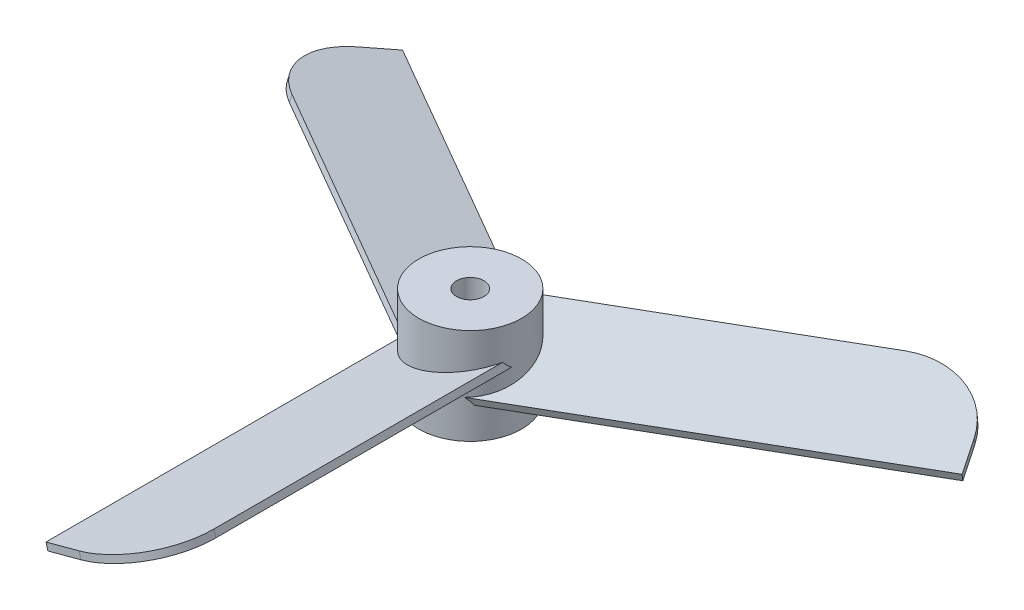
ISO-10303-21;
HEADER;
FILE_DESCRIPTION(('STEP AP214'),'2;1');
FILE_NAME('part.step','',(''),(''),'','','');
FILE_SCHEMA(('AUTOMOTIVE_DESIGN { 1 0 10303 214 1 1 1 1 }'));
ENDSEC;
DATA;
#1=APPLICATION_CONTEXT('core data for automotive mechanical design processes');
#2=APPLICATION_PROTOCOL_DEFINITION('international standard','automotive_design',2000,#1);
#3=PRODUCT_CONTEXT('',#1,'mechanical');
#4=PRODUCT('Part','Part','',(#3));
#5=PRODUCT_RELATED_PRODUCT_CATEGORY('part','',(#4));
#6=PRODUCT_DEFINITION_FORMATION('','',#4);
#7=PRODUCT_DEFINITION_CONTEXT('part definition',#1,'design');
#8=PRODUCT_DEFINITION('design','',#6,#7);
#9=PRODUCT_DEFINITION_SHAPE('','',#8);
#10=(LENGTH_UNIT() NAMED_UNIT(*) SI_UNIT(.MILLI.,.METRE.));
#11=(NAMED_UNIT(*) PLANE_ANGLE_UNIT() SI_UNIT($,.RADIAN.));
#12=(NAMED_UNIT(*) SI_UNIT($,.STERADIAN.) SOLID_ANGLE_UNIT());
#13=UNCERTAINTY_MEASURE_WITH_UNIT(LENGTH_MEASURE(1.E-05),#10,'distance_accuracy_value','');
#14=(GEOMETRIC_REPRESENTATION_CONTEXT(3) GLOBAL_UNCERTAINTY_ASSIGNED_CONTEXT((#13)) GLOBAL_UNIT_ASSIGNED_CONTEXT((#10,
#11,#12)) REPRESENTATION_CONTEXT('',''));
#15=CARTESIAN_POINT('',(0.,0.,0.));
#16=DIRECTION('',(0.,0.,1.));
#17=DIRECTION('',(1.,0.,0.));
#18=AXIS2_PLACEMENT_3D('',#15,#16,#17);
#19=CARTESIAN_POINT('',(0.,14.,0.));
#20=DIRECTION('',(0.,-1.,0.));
#21=DIRECTION('',(0.,0.,-1.));
#22=AXIS2_PLACEMENT_3D('',#19,#20,#21);
#23=CYLINDRICAL_SURFACE('',#22,7.5);
#24=CARTESIAN_POINT('',(0.,-21.9777747886716,0.));
#25=DIRECTION('',(-0.482962913144526,0.258819045102524,-0.836516303737811));
#26=DIRECTION('',(-0.12940952255126,-0.965925826289067,-0.224143868042018));
#27=AXIS2_PLACEMENT_3D('',#24,#25,#26);
#28=ELLIPSE('',#27,28.9777747886716,7.5);
#29=CARTESIAN_POINT('',(5.62125049264613,4.55885716173106,4.96503201388728));
#30=VERTEX_POINT('',#29);
#31=CARTESIAN_POINT('',(4.85398707226255,5.55885716173106,5.7174128329436));
#32=VERTEX_POINT('',#31);
#33=EDGE_CURVE('E157',#30,#32,#28,.F.);
#34=ORIENTED_EDGE('',*,*,#33,.T.);
#35=CARTESIAN_POINT('',(0.,7.53589838486225,0.));
#36=DIRECTION('',(0.12940952255126,0.965925826289067,0.224143868042018));
#37=DIRECTION('',(0.482962913144526,-0.258819045102525,0.836516303737811));
#38=AXIS2_PLACEMENT_3D('',#35,#36,#37);
#39=ELLIPSE('',#38,7.76457135307563,7.5);
#40=CARTESIAN_POINT('',(-1.48921860830618,9.44114283826893,-7.35066173461101));
#41=VERTEX_POINT('',#40);
#42=EDGE_CURVE('E145',#32,#41,#39,.T.);
#43=ORIENTED_EDGE('',*,*,#42,.T.);
#44=CARTESIAN_POINT('',(0.,35.9777747886716,0.));
#45=DIRECTION('',(-0.482962913144526,0.258819045102525,-0.836516303737811));
#46=DIRECTION('',(-0.12940952255126,-0.965925826289067,-0.224143868042018));
#47=AXIS2_PLACEMENT_3D('',#44,#45,#46);
#48=ELLIPSE('',#47,28.9777747886716,7.5);
#49=CARTESIAN_POINT('',(-2.52443122112087,8.44114283826893,-7.06238253069247));
#50=VERTEX_POINT('',#49);
#51=EDGE_CURVE('E155',#50,#41,#48,.F.);
#52=ORIENTED_EDGE('',*,*,#51,.F.);
#53=CARTESIAN_POINT('',(0.,6.46410161513775,0.));
#54=DIRECTION('',(0.12940952255126,0.965925826289067,0.224143868042018));
#55=DIRECTION('',(0.482962913144526,-0.258819045102525,0.836516303737812));
#56=AXIS2_PLACEMENT_3D('',#53,#54,#55);
#57=ELLIPSE('',#56,7.76457135307563,7.5);
#58=EDGE_CURVE('E161',#30,#50,#57,.T.);
#59=ORIENTED_EDGE('',*,*,#58,.F.);
#60=EDGE_LOOP('',(#34,#43,#52,#59));
#61=FACE_BOUND('',#60,.T.);
#62=CARTESIAN_POINT('',(0.,-21.9777747886716,0.));
#63=DIRECTION('',(0.965925826289067,0.258819045102524,0.));
#64=DIRECTION('',(0.258819045102525,-0.965925826289067,0.));
#65=AXIS2_PLACEMENT_3D('',#62,#63,#64);
#66=ELLIPSE('',#65,28.9777747886716,7.5);
#67=CARTESIAN_POINT('',(-7.11046910095244,4.55885716173106,2.38562972072377));
#68=VERTEX_POINT('',#67);
#69=CARTESIAN_POINT('',(-7.37841829338357,5.55885716173106,1.34496969774889));
#70=VERTEX_POINT('',#69);
#71=EDGE_CURVE('E227',#68,#70,#66,.F.);
#72=ORIENTED_EDGE('',*,*,#71,.T.);
#73=CARTESIAN_POINT('',(0.,7.53589838486225,0.));
#74=DIRECTION('',(-0.258819045102525,0.965925826289067,0.));
#75=DIRECTION('',(-0.965925826289067,-0.258819045102525,0.));
#76=AXIS2_PLACEMENT_3D('',#73,#74,#75);
#77=ELLIPSE('',#76,7.76457135307563,7.5);
#78=CARTESIAN_POINT('',(7.11046910095244,9.44114283826893,2.38562972072377));
#79=VERTEX_POINT('',#78);
#80=EDGE_CURVE('E277',#70,#79,#77,.T.);
#81=ORIENTED_EDGE('',*,*,#80,.T.);
#82=CARTESIAN_POINT('',(0.,35.9777747886716,0.));
#83=DIRECTION('',(0.965925826289067,0.258819045102525,0.));
#84=DIRECTION('',(0.258819045102525,-0.965925826289067,0.));
#85=AXIS2_PLACEMENT_3D('',#82,#83,#84);
#86=ELLIPSE('',#85,28.9777747886716,7.5);
#87=CARTESIAN_POINT('',(7.37841829338357,8.44114283826893,1.34496969774889));
#88=VERTEX_POINT('',#87);
#89=EDGE_CURVE('E214',#88,#79,#86,.F.);
#90=ORIENTED_EDGE('',*,*,#89,.F.);
#91=CARTESIAN_POINT('',(0.,6.46410161513775,0.));
#92=DIRECTION('',(-0.258819045102525,0.965925826289067,0.));
#93=DIRECTION('',(-0.965925826289067,-0.258819045102525,0.));
#94=AXIS2_PLACEMENT_3D('',#91,#92,#93);
#95=ELLIPSE('',#94,7.76457135307563,7.5);
#96=EDGE_CURVE('E270',#68,#88,#95,.T.);
#97=ORIENTED_EDGE('',*,*,#96,.F.);
#98=EDGE_LOOP('',(#72,#81,#90,#97));
#99=FACE_BOUND('',#98,.T.);
#100=CARTESIAN_POINT('',(0.,0.,0.));
#101=DIRECTION('',(0.,1.,0.));
#102=DIRECTION('',(0.,0.,1.));
#103=AXIS2_PLACEMENT_3D('',#100,#101,#102);
#104=CIRCLE('',#103,7.5);
#105=CARTESIAN_POINT('',(0.,0.,7.5));
#106=VERTEX_POINT('',#105);
#107=EDGE_CURVE('E265',#106,#106,#104,.T.);
#108=ORIENTED_EDGE('',*,*,#107,.T.);
#109=EDGE_LOOP('',(#108));
#110=FACE_BOUND('',#109,.T.);
#111=CARTESIAN_POINT('',(0.,14.,0.));
#112=DIRECTION('',(0.,1.,0.));
#113=DIRECTION('',(0.,0.,1.));
#114=AXIS2_PLACEMENT_3D('',#111,#112,#113);
#115=CIRCLE('',#114,7.5);
#116=CARTESIAN_POINT('',(0.,14.,7.5));
#117=VERTEX_POINT('',#116);
#118=EDGE_CURVE('E266',#117,#117,#115,.T.);
#119=ORIENTED_EDGE('',*,*,#118,.F.);
#120=EDGE_LOOP('',(#119));
#121=FACE_BOUND('',#120,.T.);
#122=CARTESIAN_POINT('',(0.,-21.9777747886716,0.));
#123=DIRECTION('',(-0.482962913144538,0.258819045102524,0.836516303737805));
#124=DIRECTION('',(-0.129409522551263,-0.965925826289067,0.224143868042016));
#125=AXIS2_PLACEMENT_3D('',#122,#123,#124);
#126=ELLIPSE('',#125,28.9777747886716,7.5);
#127=CARTESIAN_POINT('',(1.48921860830627,4.55885716173106,-7.35066173461101));
#128=VERTEX_POINT('',#127);
#129=CARTESIAN_POINT('',(2.52443122112101,5.55885716173106,-7.06238253069243));
#130=VERTEX_POINT('',#129);
#131=EDGE_CURVE('E193',#128,#130,#126,.F.);
#132=ORIENTED_EDGE('',*,*,#131,.T.);
#133=CARTESIAN_POINT('',(0.,7.53589838486224,0.));
#134=DIRECTION('',(0.129409522551263,0.965925826289067,-0.224143868042016));
#135=DIRECTION('',(0.482962913144538,-0.258819045102525,-0.836516303737805));
#136=AXIS2_PLACEMENT_3D('',#133,#134,#135);
#137=ELLIPSE('',#136,7.76457135307563,7.5);
#138=CARTESIAN_POINT('',(-5.62125049264621,9.44114283826893,4.96503201388719));
#139=VERTEX_POINT('',#138);
#140=EDGE_CURVE('E298',#130,#139,#137,.T.);
#141=ORIENTED_EDGE('',*,*,#140,.T.);
#142=CARTESIAN_POINT('',(0.,35.9777747886716,0.));
#143=DIRECTION('',(-0.482962913144538,0.258819045102525,0.836516303737805));
#144=DIRECTION('',(-0.129409522551263,-0.965925826289067,0.224143868042016));
#145=AXIS2_PLACEMENT_3D('',#142,#143,#144);
#146=ELLIPSE('',#145,28.9777747886716,7.5);
#147=CARTESIAN_POINT('',(-4.85398707226262,8.44114283826893,5.71741283294353));
#148=VERTEX_POINT('',#147);
#149=EDGE_CURVE('E183',#148,#139,#146,.F.);
#150=ORIENTED_EDGE('',*,*,#149,.F.);
#151=CARTESIAN_POINT('',(0.,6.46410161513775,0.));
#152=DIRECTION('',(0.129409522551263,0.965925826289067,-0.224143868042016));
#153=DIRECTION('',(0.482962913144538,-0.258819045102525,-0.836516303737805));
#154=AXIS2_PLACEMENT_3D('',#151,#152,#153);
#155=ELLIPSE('',#154,7.76457135307563,7.5);
#156=EDGE_CURVE('E294',#128,#148,#155,.T.);
#157=ORIENTED_EDGE('',*,*,#156,.F.);
#158=EDGE_LOOP('',(#132,#141,#150,#157));
#159=FACE_BOUND('',#158,.T.);
#160=ADVANCED_FACE('F39',(#61,#99,#110,#121,#159),#23,.T.);
#161=CARTESIAN_POINT('',(0.,14.,0.));
#162=DIRECTION('',(0.,1.,0.));
#163=DIRECTION('',(0.,0.,1.));
#164=AXIS2_PLACEMENT_3D('',#161,#162,#163);
#165=PLANE('',#164);
#166=CARTESIAN_POINT('',(0.,14.,0.));
#167=DIRECTION('',(0.,1.,0.));
#168=DIRECTION('',(0.,0.,1.));
#169=AXIS2_PLACEMENT_3D('',#166,#167,#168);
#170=CIRCLE('',#169,2.);
#171=CARTESIAN_POINT('',(0.,14.,2.));
#172=VERTEX_POINT('',#171);
#173=EDGE_CURVE('E248',#172,#172,#170,.T.);
#174=ORIENTED_EDGE('',*,*,#173,.F.);
#175=EDGE_LOOP('',(#174));
#176=FACE_BOUND('',#175,.T.);
#177=ORIENTED_EDGE('',*,*,#118,.T.);
#178=EDGE_LOOP('',(#177));
#179=FACE_BOUND('',#178,.T.);
#180=ADVANCED_FACE('F341',(#176,#179),#165,.T.);
#181=CARTESIAN_POINT('',(0.,0.,0.));
#182=DIRECTION('',(0.,1.,0.));
#183=DIRECTION('',(0.,0.,1.));
#184=AXIS2_PLACEMENT_3D('',#181,#182,#183);
#185=PLANE('',#184);
#186=CARTESIAN_POINT('',(0.,0.,0.));
#187=DIRECTION('',(0.,1.,0.));
#188=DIRECTION('',(0.,0.,1.));
#189=AXIS2_PLACEMENT_3D('',#186,#187,#188);
#190=CIRCLE('',#189,2.);
#191=CARTESIAN_POINT('',(0.,0.,2.));
#192=VERTEX_POINT('',#191);
#193=EDGE_CURVE('E261',#192,#192,#190,.F.);
#194=ORIENTED_EDGE('',*,*,#193,.F.);
#195=EDGE_LOOP('',(#194));
#196=FACE_BOUND('',#195,.T.);
#197=ORIENTED_EDGE('',*,*,#107,.F.);
#198=EDGE_LOOP('',(#197));
#199=FACE_BOUND('',#198,.T.);
#200=ADVANCED_FACE('F346',(#196,#199),#185,.F.);
#201=CARTESIAN_POINT('',(0.,-0.000999999999999265,0.));
#202=DIRECTION('',(0.,1.,0.));
#203=DIRECTION('',(0.,0.,1.));
#204=AXIS2_PLACEMENT_3D('',#201,#202,#203);
#205=CYLINDRICAL_SURFACE('',#204,2.);
#206=CARTESIAN_POINT('',(0.,14.,2.));
#207=CARTESIAN_POINT('',(0.,13.8541666666667,2.));
#208=CARTESIAN_POINT('',(0.,13.7083333333333,2.));
#209=CARTESIAN_POINT('',(0.,13.4166666666667,2.));
#210=CARTESIAN_POINT('',(0.,13.2708333333333,2.));
#211=CARTESIAN_POINT('',(0.,12.9791666666667,2.));
#212=CARTESIAN_POINT('',(0.,12.8333333333333,2.));
#213=CARTESIAN_POINT('',(0.,12.5416666666667,2.));
#214=CARTESIAN_POINT('',(0.,12.3958333333333,2.));
#215=CARTESIAN_POINT('',(0.,12.1041666666667,2.));
#216=CARTESIAN_POINT('',(0.,11.9583333333333,2.));
#217=CARTESIAN_POINT('',(0.,11.6666666666667,2.));
#218=CARTESIAN_POINT('',(0.,11.5208333333333,2.));
#219=CARTESIAN_POINT('',(0.,11.2291666666667,2.));
#220=CARTESIAN_POINT('',(0.,11.0833333333333,2.));
#221=CARTESIAN_POINT('',(0.,10.7916666666667,2.));
#222=CARTESIAN_POINT('',(0.,10.6458333333333,2.));
#223=CARTESIAN_POINT('',(0.,10.3541666666667,2.));
#224=CARTESIAN_POINT('',(0.,10.2083333333333,2.));
#225=CARTESIAN_POINT('',(0.,9.91666666666667,2.));
#226=CARTESIAN_POINT('',(0.,9.77083333333333,2.));
#227=CARTESIAN_POINT('',(0.,9.47916666666667,2.));
#228=CARTESIAN_POINT('',(0.,9.33333333333333,2.));
#229=CARTESIAN_POINT('',(0.,9.04166666666666,2.));
#230=CARTESIAN_POINT('',(0.,8.89583333333333,2.));
#231=CARTESIAN_POINT('',(0.,8.60416666666666,2.));
#232=CARTESIAN_POINT('',(0.,8.45833333333333,2.));
#233=CARTESIAN_POINT('',(0.,8.16666666666667,2.));
#234=CARTESIAN_POINT('',(0.,8.02083333333333,2.));
#235=CARTESIAN_POINT('',(0.,7.72916666666667,2.));
#236=CARTESIAN_POINT('',(0.,7.58333333333333,2.));
#237=CARTESIAN_POINT('',(0.,7.29166666666667,2.));
#238=CARTESIAN_POINT('',(0.,7.14583333333333,2.));
#239=CARTESIAN_POINT('',(0.,6.85416666666667,2.));
#240=CARTESIAN_POINT('',(0.,6.70833333333333,2.));
#241=CARTESIAN_POINT('',(0.,6.41666666666667,2.));
#242=CARTESIAN_POINT('',(0.,6.27083333333333,2.));
#243=CARTESIAN_POINT('',(0.,5.97916666666667,2.));
#244=CARTESIAN_POINT('',(0.,5.83333333333333,2.));
#245=CARTESIAN_POINT('',(0.,5.54166666666667,2.));
#246=CARTESIAN_POINT('',(0.,5.39583333333333,2.));
#247=CARTESIAN_POINT('',(0.,5.10416666666667,2.));
#248=CARTESIAN_POINT('',(0.,4.95833333333333,2.));
#249=CARTESIAN_POINT('',(0.,4.66666666666667,2.));
#250=CARTESIAN_POINT('',(0.,4.52083333333333,2.));
#251=CARTESIAN_POINT('',(0.,4.22916666666667,2.));
#252=CARTESIAN_POINT('',(0.,4.08333333333333,2.));
#253=CARTESIAN_POINT('',(0.,3.79166666666667,2.));
#254=CARTESIAN_POINT('',(0.,3.64583333333333,2.));
#255=CARTESIAN_POINT('',(0.,3.35416666666667,2.));
#256=CARTESIAN_POINT('',(0.,3.20833333333333,2.));
#257=CARTESIAN_POINT('',(0.,2.91666666666667,2.));
#258=CARTESIAN_POINT('',(0.,2.77083333333333,2.));
#259=CARTESIAN_POINT('',(0.,2.47916666666667,2.));
#260=CARTESIAN_POINT('',(0.,2.33333333333333,2.));
#261=CARTESIAN_POINT('',(0.,2.04166666666667,2.));
#262=CARTESIAN_POINT('',(0.,1.89583333333333,2.));
#263=CARTESIAN_POINT('',(0.,1.60416666666667,2.));
#264=CARTESIAN_POINT('',(0.,1.45833333333333,2.));
#265=CARTESIAN_POINT('',(0.,1.16666666666667,2.));
#266=CARTESIAN_POINT('',(0.,1.02083333333333,2.));
#267=CARTESIAN_POINT('',(0.,0.729166666666667,2.));
#268=CARTESIAN_POINT('',(0.,0.583333333333334,2.));
#269=CARTESIAN_POINT('',(0.,0.291666666666667,2.));
#270=CARTESIAN_POINT('',(0.,0.145833333333333,2.));
#271=CARTESIAN_POINT('',(0.,0.,2.));
#272=B_SPLINE_CURVE_WITH_KNOTS('',3,(#206,#207,#208,#209,#210,#211,#212,#213,#214,#215,#216,
#217,#218,#219,#220,#221,#222,#223,#224,#225,#226,#227,#228,#229,#230,#231,#232,#233,#234,#235,
#236,#237,#238,#239,#240,#241,#242,#243,#244,#245,#246,#247,#248,#249,#250,#251,#252,#253,#254,
#255,#256,#257,#258,#259,#260,#261,#262,#263,#264,#265,#266,#267,#268,#269,#270,#271),
.UNSPECIFIED.,.F.,.F.,(4,2,2,2,2,2,2,2,2,2,2,2,2,2,2,2,2,2,2,2,2,2,2,2,2,2,2,2,2,2,2,2,4),(0.,
0.4375,0.875000000000001,1.3125,1.75,2.1875,2.625,3.0625,3.5,3.9375,4.375,4.8125,5.25,5.6875,
6.125,6.5625,7.,7.4375,7.875,8.3125,8.75,9.1875,9.625,10.0625,10.5,10.9375,11.375,11.8125,12.25,
12.6875,13.125,13.5625,14.),.UNSPECIFIED.);
#273=EDGE_CURVE('BSEAM385',#172,#192,#272,.T.);
#274=ORIENTED_EDGE('',*,*,#173,.T.);
#275=ORIENTED_EDGE('',*,*,#193,.T.);
#276=ORIENTED_EDGE('',*,*,#273,.T.);
#277=ORIENTED_EDGE('',*,*,#273,.F.);
#278=EDGE_LOOP('',(#274,#276,#275,#277));
#279=FACE_BOUND('',#278,.T.);
#280=ADVANCED_FACE('F385',(#279),#205,.F.);
#281=CARTESIAN_POINT('',(-7.37841829338357,5.55885716173106,54.5));
#282=DIRECTION('',(-0.258819045102525,0.965925826289067,0.));
#283=DIRECTION('',(-0.965925826289067,-0.258819045102525,0.));
#284=AXIS2_PLACEMENT_3D('',#281,#282,#283);
#285=PLANE('',#284);
#286=DIRECTION('',(0.965925826289067,0.258819045102525,0.));
#287=VECTOR('',#286,1.);
#288=CARTESIAN_POINT('',(-7.37841829338357,5.55885716173106,54.5));
#289=LINE('',#288,#287);
#290=CARTESIAN_POINT('',(-7.37841829338357,5.55885716173106,54.5));
#291=VERTEX_POINT('',#290);
#292=CARTESIAN_POINT('',(-2.54878916193824,6.85295238724369,54.5));
#293=VERTEX_POINT('',#292);
#294=EDGE_CURVE('E231',#291,#293,#289,.T.);
#295=ORIENTED_EDGE('',*,*,#294,.T.);
#296=CARTESIAN_POINT('',(-2.54878916193824,6.85295238724369,44.5));
#297=DIRECTION('',(-0.258819045102525,0.965925826289067,0.));
#298=DIRECTION('',(-0.965925826289067,-0.258819045102525,0.));
#299=AXIS2_PLACEMENT_3D('',#296,#297,#298);
#300=CIRCLE('',#299,10.);
#301=CARTESIAN_POINT('',(7.11046910095244,9.44114283826893,44.5));
#302=VERTEX_POINT('',#301);
#303=EDGE_CURVE('E285',#293,#302,#300,.T.);
#304=ORIENTED_EDGE('',*,*,#303,.T.);
#305=DIRECTION('',(0.,0.,-1.));
#306=VECTOR('',#305,1.);
#307=CARTESIAN_POINT('',(7.11046910095244,9.44114283826893,54.5));
#308=LINE('',#307,#306);
#309=EDGE_CURVE('E243',#302,#79,#308,.T.);
#310=ORIENTED_EDGE('',*,*,#309,.T.);
#311=ORIENTED_EDGE('',*,*,#80,.F.);
#312=DIRECTION('',(0.,0.,-1.));
#313=VECTOR('',#312,1.);
#314=CARTESIAN_POINT('',(-7.37841829338357,5.55885716173106,54.5));
#315=LINE('',#314,#313);
#316=EDGE_CURVE('E244',#291,#70,#315,.T.);
#317=ORIENTED_EDGE('',*,*,#316,.F.);
#318=EDGE_LOOP('',(#295,#304,#310,#311,#317));
#319=FACE_BOUND('',#318,.T.);
#320=ADVANCED_FACE('F383',(#319),#285,.T.);
#321=CARTESIAN_POINT('',(-7.11046910095244,4.55885716173106,54.5));
#322=DIRECTION('',(-0.258819045102525,0.965925826289067,0.));
#323=DIRECTION('',(-0.965925826289067,-0.258819045102525,0.));
#324=AXIS2_PLACEMENT_3D('',#321,#322,#323);
#325=PLANE('',#324);
#326=DIRECTION('',(0.,0.,-1.));
#327=VECTOR('',#326,1.);
#328=CARTESIAN_POINT('',(7.37841829338357,8.44114283826893,54.5));
#329=LINE('',#328,#327);
#330=CARTESIAN_POINT('',(7.37841829338357,8.44114283826893,44.5));
#331=VERTEX_POINT('',#330);
#332=EDGE_CURVE('E253',#331,#88,#329,.T.);
#333=ORIENTED_EDGE('',*,*,#332,.F.);
#334=CARTESIAN_POINT('',(-2.28083996950711,5.85295238724369,44.5));
#335=DIRECTION('',(-0.258819045102525,0.965925826289067,0.));
#336=DIRECTION('',(-0.965925826289067,-0.258819045102525,0.));
#337=AXIS2_PLACEMENT_3D('',#334,#335,#336);
#338=CIRCLE('',#337,10.);
#339=CARTESIAN_POINT('',(-2.28083996950711,5.85295238724369,54.5));
#340=VERTEX_POINT('',#339);
#341=EDGE_CURVE('E291',#331,#340,#338,.F.);
#342=ORIENTED_EDGE('',*,*,#341,.T.);
#343=DIRECTION('',(0.965925826289067,0.258819045102525,0.));
#344=VECTOR('',#343,1.);
#345=CARTESIAN_POINT('',(-7.11046910095244,4.55885716173106,54.5));
#346=LINE('',#345,#344);
#347=CARTESIAN_POINT('',(-7.11046910095244,4.55885716173106,54.5));
#348=VERTEX_POINT('',#347);
#349=EDGE_CURVE('E235',#348,#340,#346,.T.);
#350=ORIENTED_EDGE('',*,*,#349,.F.);
#351=DIRECTION('',(0.,0.,-1.));
#352=VECTOR('',#351,1.);
#353=CARTESIAN_POINT('',(-7.11046910095244,4.55885716173106,54.5));
#354=LINE('',#353,#352);
#355=EDGE_CURVE('E249',#348,#68,#354,.T.);
#356=ORIENTED_EDGE('',*,*,#355,.T.);
#357=ORIENTED_EDGE('',*,*,#96,.T.);
#358=EDGE_LOOP('',(#333,#342,#350,#356,#357));
#359=FACE_BOUND('',#358,.T.);
#360=ADVANCED_FACE('F372',(#359),#325,.F.);
#361=CARTESIAN_POINT('',(-7.11046910095244,4.55885716173106,54.5));
#362=DIRECTION('',(-0.965925826289067,-0.258819045102524,0.));
#363=DIRECTION('',(0.258819045102525,-0.965925826289067,0.));
#364=AXIS2_PLACEMENT_3D('',#361,#362,#363);
#365=PLANE('',#364);
#366=ORIENTED_EDGE('',*,*,#316,.T.);
#367=ORIENTED_EDGE('',*,*,#71,.F.);
#368=ORIENTED_EDGE('',*,*,#355,.F.);
#369=DIRECTION('',(-0.258819045102524,0.965925826289067,0.));
#370=VECTOR('',#369,1.);
#371=CARTESIAN_POINT('',(-7.11046910095244,4.55885716173106,54.5));
#372=LINE('',#371,#370);
#373=EDGE_CURVE('E239',#348,#291,#372,.T.);
#374=ORIENTED_EDGE('',*,*,#373,.T.);
#375=EDGE_LOOP('',(#366,#367,#368,#374));
#376=FACE_BOUND('',#375,.T.);
#377=ADVANCED_FACE('F376',(#376),#365,.T.);
#378=CARTESIAN_POINT('',(7.37841829338357,8.44114283826893,54.5));
#379=DIRECTION('',(-0.965925826289067,-0.258819045102525,0.));
#380=DIRECTION('',(0.258819045102525,-0.965925826289067,0.));
#381=AXIS2_PLACEMENT_3D('',#378,#379,#380);
#382=PLANE('',#381);
#383=ORIENTED_EDGE('',*,*,#309,.F.);
#384=DIRECTION('',(-0.258819045102525,0.965925826289067,0.));
#385=VECTOR('',#384,1.);
#386=CARTESIAN_POINT('',(7.37841829338357,8.44114283826893,44.5));
#387=LINE('',#386,#385);
#388=EDGE_CURVE('E288',#302,#331,#387,.F.);
#389=ORIENTED_EDGE('',*,*,#388,.T.);
#390=ORIENTED_EDGE('',*,*,#332,.T.);
#391=ORIENTED_EDGE('',*,*,#89,.T.);
#392=EDGE_LOOP('',(#383,#389,#390,#391));
#393=FACE_BOUND('',#392,.T.);
#394=ADVANCED_FACE('F363',(#393),#382,.F.);
#395=CARTESIAN_POINT('',(0.,0.,54.5));
#396=DIRECTION('',(0.,0.,1.));
#397=DIRECTION('',(1.,0.,0.));
#398=AXIS2_PLACEMENT_3D('',#395,#396,#397);
#399=PLANE('',#398);
#400=ORIENTED_EDGE('',*,*,#349,.T.);
#401=DIRECTION('',(-0.258819045102525,0.965925826289067,0.));
#402=VECTOR('',#401,1.);
#403=CARTESIAN_POINT('',(-2.54878916193824,6.85295238724369,54.5));
#404=LINE('',#403,#402);
#405=EDGE_CURVE('E281',#340,#293,#404,.T.);
#406=ORIENTED_EDGE('',*,*,#405,.T.);
#407=ORIENTED_EDGE('',*,*,#294,.F.);
#408=ORIENTED_EDGE('',*,*,#373,.F.);
#409=EDGE_LOOP('',(#400,#406,#407,#408));
#410=FACE_BOUND('',#409,.T.);
#411=ADVANCED_FACE('F354',(#410),#399,.T.);
#412=CARTESIAN_POINT('',(-0.664814565722646,-0.178136526001834,44.5));
#413=DIRECTION('',(0.258819045102525,-0.965925826289067,0.));
#414=DIRECTION('',(0.965925826289067,0.258819045102525,0.));
#415=AXIS2_PLACEMENT_3D('',#412,#413,#414);
#416=CYLINDRICAL_SURFACE('',#415,10.);
#417=ORIENTED_EDGE('',*,*,#341,.F.);
#418=ORIENTED_EDGE('',*,*,#388,.F.);
#419=ORIENTED_EDGE('',*,*,#303,.F.);
#420=ORIENTED_EDGE('',*,*,#405,.F.);
#421=EDGE_LOOP('',(#417,#418,#419,#420));
#422=FACE_BOUND('',#421,.T.);
#423=ADVANCED_FACE('F351',(#422),#416,.T.);
#424=CARTESIAN_POINT('',(-43.50917535956,5.55885716173106,-33.6398976818182));
#425=DIRECTION('',(0.129409522551263,0.965925826289067,-0.224143868042016));
#426=DIRECTION('',(0.,0.226044624379459,0.974116947696297));
#427=AXIS2_PLACEMENT_3D('',#424,#425,#426);
#428=PLANE('',#427);
#429=DIRECTION('',(-0.482962913144537,0.258819045102525,0.836516303737805));
#430=VECTOR('',#429,1.);
#431=CARTESIAN_POINT('',(-43.50917535956,5.55885716173106,-33.6398976818182));
#432=LINE('',#431,#430);
#433=CARTESIAN_POINT('',(-43.50917535956,5.55885716173106,-33.6398976818182));
#434=VERTEX_POINT('',#433);
#435=CARTESIAN_POINT('',(-45.9239899252827,6.85295238724369,-29.4573161631292));
#436=VERTEX_POINT('',#435);
#437=EDGE_CURVE('E197',#434,#436,#432,.T.);
#438=ORIENTED_EDGE('',*,*,#437,.T.);
#439=CARTESIAN_POINT('',(-37.2637358874383,6.85295238724369,-24.4573161631291));
#440=DIRECTION('',(0.129409522551263,0.965925826289067,-0.224143868042016));
#441=DIRECTION('',(0.,0.226044624379459,0.974116947696297));
#442=AXIS2_PLACEMENT_3D('',#439,#440,#441);
#443=CIRCLE('',#442,10.);
#444=CARTESIAN_POINT('',(-42.0933650188837,9.44114283826893,-16.0921531257511));
#445=VERTEX_POINT('',#444);
#446=EDGE_CURVE('E307',#436,#445,#443,.T.);
#447=ORIENTED_EDGE('',*,*,#446,.T.);
#448=DIRECTION('',(0.866025403784436,0.,0.500000000000004));
#449=VECTOR('',#448,1.);
#450=CARTESIAN_POINT('',(-50.753619056728,9.44114283826893,-21.0921531257511));
#451=LINE('',#450,#449);
#452=EDGE_CURVE('E209',#445,#139,#451,.T.);
#453=ORIENTED_EDGE('',*,*,#452,.T.);
#454=ORIENTED_EDGE('',*,*,#140,.F.);
#455=DIRECTION('',(0.866025403784436,0.,0.500000000000004));
#456=VECTOR('',#455,1.);
#457=CARTESIAN_POINT('',(-43.50917535956,5.55885716173106,-33.6398976818182));
#458=LINE('',#457,#456);
#459=EDGE_CURVE('E210',#434,#130,#458,.T.);
#460=ORIENTED_EDGE('',*,*,#459,.F.);
#461=EDGE_LOOP('',(#438,#447,#453,#454,#460));
#462=FACE_BOUND('',#461,.T.);
#463=ADVANCED_FACE('F353',(#462),#428,.T.);
#464=CARTESIAN_POINT('',(-43.6431499557755,4.55885716173106,-33.4078468742493));
#465=DIRECTION('',(0.129409522551263,0.965925826289067,-0.224143868042016));
#466=DIRECTION('',(0.,0.226044624379458,0.974116947696297));
#467=AXIS2_PLACEMENT_3D('',#464,#465,#466);
#468=PLANE('',#467);
#469=DIRECTION('',(0.866025403784436,0.,0.500000000000004));
#470=VECTOR('',#469,1.);
#471=CARTESIAN_POINT('',(-50.8875936529436,8.44114283826893,-20.8601023181822));
#472=LINE('',#471,#470);
#473=CARTESIAN_POINT('',(-42.2273396150992,8.44114283826893,-15.8601023181822));
#474=VERTEX_POINT('',#473);
#475=EDGE_CURVE('E219',#474,#148,#472,.T.);
#476=ORIENTED_EDGE('',*,*,#475,.F.);
#477=CARTESIAN_POINT('',(-37.3977104836539,5.85295238724369,-24.2252653555603));
#478=DIRECTION('',(0.129409522551263,0.965925826289067,-0.224143868042016));
#479=DIRECTION('',(0.,0.226044624379458,0.974116947696297));
#480=AXIS2_PLACEMENT_3D('',#477,#478,#479);
#481=CIRCLE('',#480,10.);
#482=CARTESIAN_POINT('',(-46.0579645214982,5.85295238724369,-29.2252653555603));
#483=VERTEX_POINT('',#482);
#484=EDGE_CURVE('E313',#474,#483,#481,.F.);
#485=ORIENTED_EDGE('',*,*,#484,.T.);
#486=DIRECTION('',(-0.482962913144538,0.258819045102525,0.836516303737805));
#487=VECTOR('',#486,1.);
#488=CARTESIAN_POINT('',(-43.6431499557755,4.55885716173106,-33.4078468742493));
#489=LINE('',#488,#487);
#490=CARTESIAN_POINT('',(-43.6431499557755,4.55885716173106,-33.4078468742493));
#491=VERTEX_POINT('',#490);
#492=EDGE_CURVE('E201',#491,#483,#489,.T.);
#493=ORIENTED_EDGE('',*,*,#492,.F.);
#494=DIRECTION('',(0.866025403784436,0.,0.500000000000004));
#495=VECTOR('',#494,1.);
#496=CARTESIAN_POINT('',(-43.6431499557755,4.55885716173106,-33.4078468742493));
#497=LINE('',#496,#495);
#498=EDGE_CURVE('E215',#491,#128,#497,.T.);
#499=ORIENTED_EDGE('',*,*,#498,.T.);
#500=ORIENTED_EDGE('',*,*,#156,.T.);
#501=EDGE_LOOP('',(#476,#485,#493,#499,#500));
#502=FACE_BOUND('',#501,.T.);
#503=ADVANCED_FACE('F360',(#502),#468,.F.);
#504=CARTESIAN_POINT('',(-43.6431499557755,4.55885716173106,-33.4078468742493));
#505=DIRECTION('',(0.482962913144538,-0.258819045102525,-0.836516303737805));
#506=DIRECTION('',(-0.866025403784436,0.,-0.500000000000004));
#507=AXIS2_PLACEMENT_3D('',#504,#505,#506);
#508=PLANE('',#507);
#509=ORIENTED_EDGE('',*,*,#459,.T.);
#510=ORIENTED_EDGE('',*,*,#131,.F.);
#511=ORIENTED_EDGE('',*,*,#498,.F.);
#512=DIRECTION('',(0.129409522551263,0.965925826289067,-0.224143868042016));
#513=VECTOR('',#512,1.);
#514=CARTESIAN_POINT('',(-43.6431499557755,4.55885716173106,-33.4078468742493));
#515=LINE('',#514,#513);
#516=EDGE_CURVE('E205',#491,#434,#515,.T.);
#517=ORIENTED_EDGE('',*,*,#516,.T.);
#518=EDGE_LOOP('',(#509,#510,#511,#517));
#519=FACE_BOUND('',#518,.T.);
#520=ADVANCED_FACE('F403',(#519),#508,.T.);
#521=CARTESIAN_POINT('',(-50.8875936529436,8.44114283826893,-20.8601023181822));
#522=DIRECTION('',(0.482962913144538,-0.258819045102525,-0.836516303737805));
#523=DIRECTION('',(-0.866025403784436,0.,-0.500000000000004));
#524=AXIS2_PLACEMENT_3D('',#521,#522,#523);
#525=PLANE('',#524);
#526=ORIENTED_EDGE('',*,*,#452,.F.);
#527=DIRECTION('',(0.129409522551263,0.965925826289067,-0.224143868042016));
#528=VECTOR('',#527,1.);
#529=CARTESIAN_POINT('',(-42.2273396150992,8.44114283826893,-15.8601023181822));
#530=LINE('',#529,#528);
#531=EDGE_CURVE('E310',#445,#474,#530,.F.);
#532=ORIENTED_EDGE('',*,*,#531,.T.);
#533=ORIENTED_EDGE('',*,*,#475,.T.);
#534=ORIENTED_EDGE('',*,*,#149,.T.);
#535=EDGE_LOOP('',(#526,#532,#533,#534));
#536=FACE_BOUND('',#535,.T.);
#537=ADVANCED_FACE('F399',(#536),#525,.F.);
#538=CARTESIAN_POINT('',(-47.1983845062518,0.,-27.2500000000002));
#539=DIRECTION('',(-0.866025403784436,0.,-0.500000000000004));
#540=DIRECTION('',(-0.500000000000004,0.,0.866025403784436));
#541=AXIS2_PLACEMENT_3D('',#538,#539,#540);
#542=PLANE('',#541);
#543=ORIENTED_EDGE('',*,*,#492,.T.);
#544=DIRECTION('',(0.129409522551264,0.965925826289067,-0.224143868042016));
#545=VECTOR('',#544,1.);
#546=CARTESIAN_POINT('',(-45.9239899252827,6.85295238724369,-29.4573161631292));
#547=LINE('',#546,#545);
#548=EDGE_CURVE('E160',#483,#436,#547,.T.);
#549=ORIENTED_EDGE('',*,*,#548,.T.);
#550=ORIENTED_EDGE('',*,*,#437,.F.);
#551=ORIENTED_EDGE('',*,*,#516,.F.);
#552=EDGE_LOOP('',(#543,#549,#550,#551));
#553=FACE_BOUND('',#552,.T.);
#554=ADVANCED_FACE('F402',(#553),#542,.T.);
#555=CARTESIAN_POINT('',(50.8875936529439,5.55885716173106,-20.8601023181815));
#556=DIRECTION('',(0.12940952255126,0.965925826289067,0.224143868042018));
#557=DIRECTION('',(0.,-0.22604462437946,0.974116947696296));
#558=AXIS2_PLACEMENT_3D('',#555,#556,#557);
#559=PLANE('',#558);
#560=DIRECTION('',(-0.482962913144526,0.258819045102525,-0.836516303737811));
#561=VECTOR('',#560,1.);
#562=CARTESIAN_POINT('',(50.8875936529439,5.55885716173106,-20.8601023181815));
#563=LINE('',#562,#561);
#564=CARTESIAN_POINT('',(50.8875936529439,5.55885716173106,-20.8601023181815));
#565=VERTEX_POINT('',#564);
#566=CARTESIAN_POINT('',(48.4727790872213,6.85295238724369,-25.0426838368706));
#567=VERTEX_POINT('',#566);
#568=EDGE_CURVE('E168',#565,#567,#563,.T.);
#569=ORIENTED_EDGE('',*,*,#568,.T.);
#570=CARTESIAN_POINT('',(39.8125250493768,6.85295238724369,-20.0426838368707));
#571=DIRECTION('',(0.12940952255126,0.965925826289067,0.224143868042018));
#572=DIRECTION('',(0.,-0.22604462437946,0.974116947696296));
#573=AXIS2_PLACEMENT_3D('',#570,#571,#572);
#574=CIRCLE('',#573,10.);
#575=CARTESIAN_POINT('',(34.9828959179316,9.44114283826893,-28.4078468742488));
#576=VERTEX_POINT('',#575);
#577=EDGE_CURVE('E62',#567,#576,#574,.T.);
#578=ORIENTED_EDGE('',*,*,#577,.T.);
#579=DIRECTION('',(-0.866025403784443,0.,0.499999999999992));
#580=VECTOR('',#579,1.);
#581=CARTESIAN_POINT('',(43.643149955776,9.44114283826893,-33.4078468742487));
#582=LINE('',#581,#580);
#583=EDGE_CURVE('E142',#576,#41,#582,.T.);
#584=ORIENTED_EDGE('',*,*,#583,.T.);
#585=ORIENTED_EDGE('',*,*,#42,.F.);
#586=DIRECTION('',(-0.866025403784443,0.,0.499999999999992));
#587=VECTOR('',#586,1.);
#588=CARTESIAN_POINT('',(50.8875936529439,5.55885716173106,-20.8601023181815));
#589=LINE('',#588,#587);
#590=EDGE_CURVE('E180',#565,#32,#589,.T.);
#591=ORIENTED_EDGE('',*,*,#590,.F.);
#592=EDGE_LOOP('',(#569,#578,#584,#585,#591));
#593=FACE_BOUND('',#592,.T.);
#594=ADVANCED_FACE('F144',(#593),#559,.T.);
#595=CARTESIAN_POINT('',(50.7536190567283,4.55885716173106,-21.0921531257504));
#596=DIRECTION('',(0.12940952255126,0.965925826289067,0.224143868042018));
#597=DIRECTION('',(0.,-0.22604462437946,0.974116947696296));
#598=AXIS2_PLACEMENT_3D('',#595,#596,#597);
#599=PLANE('',#598);
#600=DIRECTION('',(-0.866025403784443,0.,0.499999999999992));
#601=VECTOR('',#600,1.);
#602=CARTESIAN_POINT('',(43.5091753595604,8.44114283826893,-33.6398976818176));
#603=LINE('',#602,#601);
#604=CARTESIAN_POINT('',(34.848921321716,8.44114283826893,-28.6398976818177));
#605=VERTEX_POINT('',#604);
#606=EDGE_CURVE('E149',#605,#50,#603,.T.);
#607=ORIENTED_EDGE('',*,*,#606,.F.);
#608=CARTESIAN_POINT('',(39.6785504531613,5.85295238724369,-20.2747346444396));
#609=DIRECTION('',(0.12940952255126,0.965925826289067,0.224143868042018));
#610=DIRECTION('',(0.,-0.22604462437946,0.974116947696296));
#611=AXIS2_PLACEMENT_3D('',#608,#609,#610);
#612=CIRCLE('',#611,10.);
#613=CARTESIAN_POINT('',(48.3388044910057,5.85295238724369,-25.2747346444395));
#614=VERTEX_POINT('',#613);
#615=EDGE_CURVE('E11',#605,#614,#612,.F.);
#616=ORIENTED_EDGE('',*,*,#615,.T.);
#617=DIRECTION('',(-0.482962913144526,0.258819045102525,-0.836516303737811));
#618=VECTOR('',#617,1.);
#619=CARTESIAN_POINT('',(50.7536190567283,4.55885716173106,-21.0921531257504));
#620=LINE('',#619,#618);
#621=CARTESIAN_POINT('',(50.7536190567283,4.55885716173106,-21.0921531257504));
#622=VERTEX_POINT('',#621);
#623=EDGE_CURVE('E173',#622,#614,#620,.T.);
#624=ORIENTED_EDGE('',*,*,#623,.F.);
#625=DIRECTION('',(-0.866025403784443,0.,0.499999999999992));
#626=VECTOR('',#625,1.);
#627=CARTESIAN_POINT('',(50.7536190567283,4.55885716173106,-21.0921531257504));
#628=LINE('',#627,#626);
#629=EDGE_CURVE('E184',#622,#30,#628,.T.);
#630=ORIENTED_EDGE('',*,*,#629,.T.);
#631=ORIENTED_EDGE('',*,*,#58,.T.);
#632=EDGE_LOOP('',(#607,#616,#624,#630,#631));
#633=FACE_BOUND('',#632,.T.);
#634=ADVANCED_FACE('F333',(#633),#599,.F.);
#635=CARTESIAN_POINT('',(50.7536190567283,4.55885716173106,-21.0921531257504));
#636=DIRECTION('',(0.482962913144526,-0.258819045102525,0.836516303737812));
#637=DIRECTION('',(0.866025403784443,0.,-0.499999999999992));
#638=AXIS2_PLACEMENT_3D('',#635,#636,#637);
#639=PLANE('',#638);
#640=ORIENTED_EDGE('',*,*,#590,.T.);
#641=ORIENTED_EDGE('',*,*,#33,.F.);
#642=ORIENTED_EDGE('',*,*,#629,.F.);
#643=DIRECTION('',(0.12940952255126,0.965925826289067,0.224143868042018));
#644=VECTOR('',#643,1.);
#645=CARTESIAN_POINT('',(50.7536190567283,4.55885716173106,-21.0921531257504));
#646=LINE('',#645,#644);
#647=EDGE_CURVE('E150',#622,#565,#646,.T.);
#648=ORIENTED_EDGE('',*,*,#647,.T.);
#649=EDGE_LOOP('',(#640,#641,#642,#648));
#650=FACE_BOUND('',#649,.T.);
#651=ADVANCED_FACE('F331',(#650),#639,.T.);
#652=CARTESIAN_POINT('',(43.5091753595604,8.44114283826893,-33.6398976818176));
#653=DIRECTION('',(0.482962913144526,-0.258819045102525,0.836516303737811));
#654=DIRECTION('',(0.866025403784443,0.,-0.499999999999992));
#655=AXIS2_PLACEMENT_3D('',#652,#653,#654);
#656=PLANE('',#655);
#657=ORIENTED_EDGE('',*,*,#583,.F.);
#658=DIRECTION('',(0.12940952255126,0.965925826289067,0.224143868042018));
#659=VECTOR('',#658,1.);
#660=CARTESIAN_POINT('',(34.848921321716,8.44114283826894,-28.6398976818177));
#661=LINE('',#660,#659);
#662=EDGE_CURVE('E48',#576,#605,#661,.F.);
#663=ORIENTED_EDGE('',*,*,#662,.T.);
#664=ORIENTED_EDGE('',*,*,#606,.T.);
#665=ORIENTED_EDGE('',*,*,#51,.T.);
#666=EDGE_LOOP('',(#657,#663,#664,#665));
#667=FACE_BOUND('',#666,.T.);
#668=ADVANCED_FACE('F163',(#667),#656,.F.);
#669=CARTESIAN_POINT('',(47.1983845062522,0.,-27.2499999999996));
#670=DIRECTION('',(0.866025403784443,0.,-0.499999999999992));
#671=DIRECTION('',(-0.499999999999992,0.,-0.866025403784443));
#672=AXIS2_PLACEMENT_3D('',#669,#670,#671);
#673=PLANE('',#672);
#674=ORIENTED_EDGE('',*,*,#623,.T.);
#675=DIRECTION('',(0.12940952255126,0.965925826289067,0.224143868042018));
#676=VECTOR('',#675,1.);
#677=CARTESIAN_POINT('',(48.4727790872213,6.85295238724369,-25.0426838368706));
#678=LINE('',#677,#676);
#679=EDGE_CURVE('E316',#614,#567,#678,.T.);
#680=ORIENTED_EDGE('',*,*,#679,.T.);
#681=ORIENTED_EDGE('',*,*,#568,.F.);
#682=ORIENTED_EDGE('',*,*,#647,.F.);
#683=EDGE_LOOP('',(#674,#680,#681,#682));
#684=FACE_BOUND('',#683,.T.);
#685=ADVANCED_FACE('F325',(#684),#673,.T.);
#686=CARTESIAN_POINT('',(-38.2057231855461,-0.178136526001833,-22.8257463027219));
#687=DIRECTION('',(-0.129409522551263,-0.965925826289067,0.224143868042016));
#688=DIRECTION('',(0.,-0.226044624379459,-0.974116947696297));
#689=AXIS2_PLACEMENT_3D('',#686,#687,#688);
#690=CYLINDRICAL_SURFACE('',#689,10.);
#691=ORIENTED_EDGE('',*,*,#484,.F.);
#692=ORIENTED_EDGE('',*,*,#531,.F.);
#693=ORIENTED_EDGE('',*,*,#446,.F.);
#694=ORIENTED_EDGE('',*,*,#548,.F.);
#695=EDGE_LOOP('',(#691,#692,#693,#694));
#696=FACE_BOUND('',#695,.T.);
#697=ADVANCED_FACE('F335',(#696),#690,.T.);
#698=CARTESIAN_POINT('',(38.870537751269,-0.178136526001835,-21.6742536972779));
#699=DIRECTION('',(-0.12940952255126,-0.965925826289067,-0.224143868042018));
#700=DIRECTION('',(0.,0.22604462437946,-0.974116947696296));
#701=AXIS2_PLACEMENT_3D('',#698,#699,#700);
#702=CYLINDRICAL_SURFACE('',#701,10.);
#703=ORIENTED_EDGE('',*,*,#615,.F.);
#704=ORIENTED_EDGE('',*,*,#662,.F.);
#705=ORIENTED_EDGE('',*,*,#577,.F.);
#706=ORIENTED_EDGE('',*,*,#679,.F.);
#707=EDGE_LOOP('',(#703,#704,#705,#706));
#708=FACE_BOUND('',#707,.T.);
#709=ADVANCED_FACE('F41',(#708),#702,.T.);
#710=CLOSED_SHELL('',(#160,#180,#200,#280,#320,#360,#377,#394,#411,#423,#463,#503,#520,#537,
#554,#594,#634,#651,#668,#685,#697,#709));
#711=MANIFOLD_SOLID_BREP('B2',#710);
#712=ADVANCED_BREP_SHAPE_REPRESENTATION('',(#18,#711),#14);
#713=SHAPE_DEFINITION_REPRESENTATION(#9,#712);
ENDSEC;
END-ISO-10303-21;
